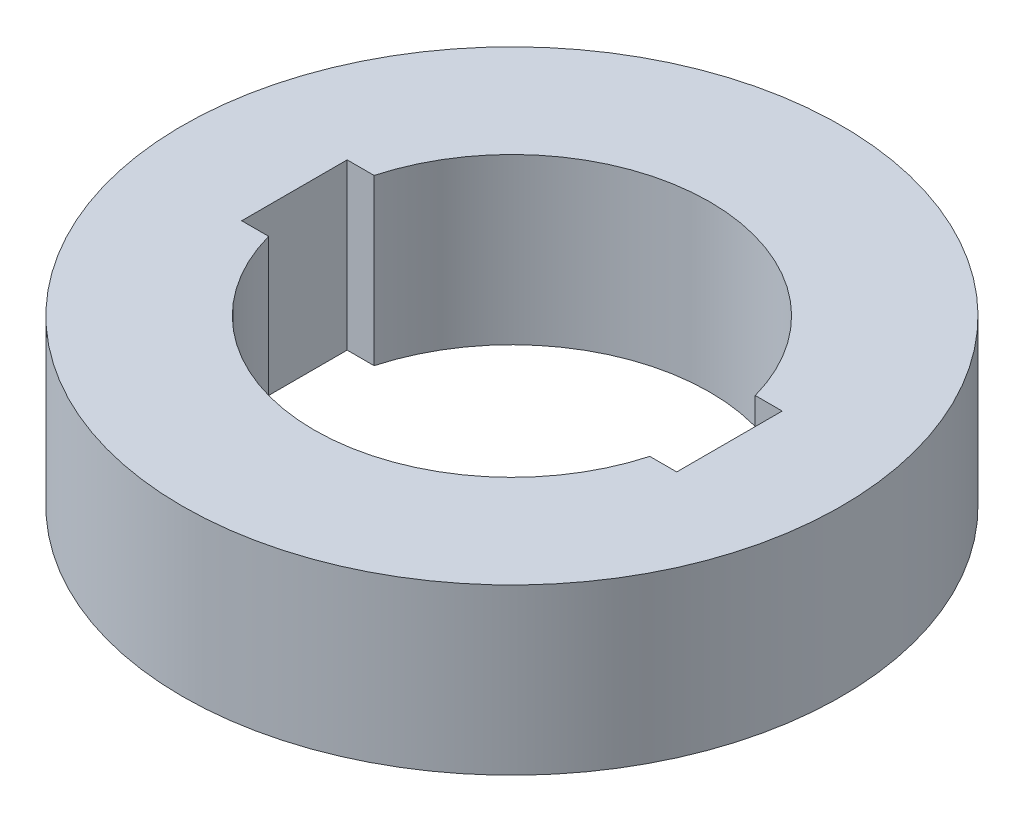
ISO-10303-21;
HEADER;
FILE_DESCRIPTION(('STEP AP214'),'2;1');
FILE_NAME('part.step','',(''),(''),'','','');
FILE_SCHEMA(('AUTOMOTIVE_DESIGN { 1 0 10303 214 1 1 1 1 }'));
ENDSEC;
DATA;
#1=APPLICATION_CONTEXT('core data for automotive mechanical design processes');
#2=APPLICATION_PROTOCOL_DEFINITION('international standard','automotive_design',2000,#1);
#3=PRODUCT_CONTEXT('',#1,'mechanical');
#4=PRODUCT('Part','Part','',(#3));
#5=PRODUCT_RELATED_PRODUCT_CATEGORY('part','',(#4));
#6=PRODUCT_DEFINITION_FORMATION('','',#4);
#7=PRODUCT_DEFINITION_CONTEXT('part definition',#1,'design');
#8=PRODUCT_DEFINITION('design','',#6,#7);
#9=PRODUCT_DEFINITION_SHAPE('','',#8);
#10=(LENGTH_UNIT() NAMED_UNIT(*) SI_UNIT(.MILLI.,.METRE.));
#11=(NAMED_UNIT(*) PLANE_ANGLE_UNIT() SI_UNIT($,.RADIAN.));
#12=(NAMED_UNIT(*) SI_UNIT($,.STERADIAN.) SOLID_ANGLE_UNIT());
#13=UNCERTAINTY_MEASURE_WITH_UNIT(LENGTH_MEASURE(1.E-05),#10,'distance_accuracy_value','');
#14=(GEOMETRIC_REPRESENTATION_CONTEXT(3) GLOBAL_UNCERTAINTY_ASSIGNED_CONTEXT((#13)) GLOBAL_UNIT_ASSIGNED_CONTEXT((#10,
#11,#12)) REPRESENTATION_CONTEXT('',''));
#15=CARTESIAN_POINT('',(0.,0.,0.));
#16=DIRECTION('',(0.,0.,1.));
#17=DIRECTION('',(1.,0.,0.));
#18=AXIS2_PLACEMENT_3D('',#15,#16,#17);
#19=CARTESIAN_POINT('',(0.,12.5,0.));
#20=DIRECTION('',(0.,1.,0.));
#21=DIRECTION('',(0.,0.,1.));
#22=AXIS2_PLACEMENT_3D('',#19,#20,#21);
#23=PLANE('',#22);
#24=CARTESIAN_POINT('',(0.,12.5,0.));
#25=DIRECTION('',(0.,1.,0.));
#26=DIRECTION('',(0.,0.,1.));
#27=AXIS2_PLACEMENT_3D('',#24,#25,#26);
#28=CIRCLE('',#27,50.);
#29=CARTESIAN_POINT('',(0.,12.5,50.));
#30=VERTEX_POINT('',#29);
#31=EDGE_CURVE('E11',#30,#30,#28,.T.);
#32=ORIENTED_EDGE('',*,*,#31,.T.);
#33=EDGE_LOOP('',(#32));
#34=FACE_BOUND('',#33,.T.);
#35=DIRECTION('',(-1.,0.,0.));
#36=VECTOR('',#35,1.);
#37=CARTESIAN_POINT('',(-28.9136645896019,12.5,-8.));
#38=LINE('',#37,#36);
#39=CARTESIAN_POINT('',(-28.9136645896019,12.5,-8.));
#40=VERTEX_POINT('',#39);
#41=CARTESIAN_POINT('',(-33.,12.5,-7.99999999999999));
#42=VERTEX_POINT('',#41);
#43=EDGE_CURVE('E112',#40,#42,#38,.T.);
#44=ORIENTED_EDGE('',*,*,#43,.F.);
#45=CARTESIAN_POINT('',(0.,12.5,0.));
#46=DIRECTION('',(0.,1.,0.));
#47=DIRECTION('',(0.,0.,1.));
#48=AXIS2_PLACEMENT_3D('',#45,#46,#47);
#49=CIRCLE('',#48,30.);
#50=CARTESIAN_POINT('',(28.9136645896019,12.5,-8.));
#51=VERTEX_POINT('',#50);
#52=EDGE_CURVE('E104',#51,#40,#49,.T.);
#53=ORIENTED_EDGE('',*,*,#52,.F.);
#54=DIRECTION('',(-1.,0.,0.));
#55=VECTOR('',#54,1.);
#56=CARTESIAN_POINT('',(28.9136645896019,12.5,-8.));
#57=LINE('',#56,#55);
#58=CARTESIAN_POINT('',(33.,12.5,-8.));
#59=VERTEX_POINT('',#58);
#60=EDGE_CURVE('E136',#59,#51,#57,.T.);
#61=ORIENTED_EDGE('',*,*,#60,.F.);
#62=DIRECTION('',(0.,0.,-1.));
#63=VECTOR('',#62,1.);
#64=CARTESIAN_POINT('',(33.,12.5,-8.));
#65=LINE('',#64,#63);
#66=CARTESIAN_POINT('',(33.,12.5,8.));
#67=VERTEX_POINT('',#66);
#68=EDGE_CURVE('E134',#67,#59,#65,.T.);
#69=ORIENTED_EDGE('',*,*,#68,.F.);
#70=DIRECTION('',(1.,0.,0.));
#71=VECTOR('',#70,1.);
#72=CARTESIAN_POINT('',(33.,12.5,8.));
#73=LINE('',#72,#71);
#74=CARTESIAN_POINT('',(28.9136645896019,12.5,8.));
#75=VERTEX_POINT('',#74);
#76=EDGE_CURVE('E132',#75,#67,#73,.T.);
#77=ORIENTED_EDGE('',*,*,#76,.F.);
#78=CARTESIAN_POINT('',(0.,12.5,0.));
#79=DIRECTION('',(0.,1.,0.));
#80=DIRECTION('',(0.,0.,1.));
#81=AXIS2_PLACEMENT_3D('',#78,#79,#80);
#82=CIRCLE('',#81,30.);
#83=CARTESIAN_POINT('',(-28.9136645896019,12.5,8.));
#84=VERTEX_POINT('',#83);
#85=EDGE_CURVE('E130',#84,#75,#82,.T.);
#86=ORIENTED_EDGE('',*,*,#85,.F.);
#87=DIRECTION('',(1.,0.,0.));
#88=VECTOR('',#87,1.);
#89=CARTESIAN_POINT('',(-33.,12.5,7.99999999999999));
#90=LINE('',#89,#88);
#91=CARTESIAN_POINT('',(-33.,12.5,7.99999999999999));
#92=VERTEX_POINT('',#91);
#93=EDGE_CURVE('E126',#92,#84,#90,.T.);
#94=ORIENTED_EDGE('',*,*,#93,.F.);
#95=DIRECTION('',(0.,0.,1.));
#96=VECTOR('',#95,1.);
#97=CARTESIAN_POINT('',(-33.,12.5,-7.99999999999999));
#98=LINE('',#97,#96);
#99=EDGE_CURVE('E124',#42,#92,#98,.T.);
#100=ORIENTED_EDGE('',*,*,#99,.F.);
#101=EDGE_LOOP('',(#44,#53,#61,#69,#77,#86,#94,#100));
#102=FACE_BOUND('',#101,.T.);
#103=ADVANCED_FACE('F39',(#34,#102),#23,.T.);
#104=CARTESIAN_POINT('',(0.,-12.5,0.));
#105=DIRECTION('',(0.,1.,0.));
#106=DIRECTION('',(0.,0.,1.));
#107=AXIS2_PLACEMENT_3D('',#104,#105,#106);
#108=PLANE('',#107);
#109=CARTESIAN_POINT('',(0.,-12.5,0.));
#110=DIRECTION('',(0.,1.,0.));
#111=DIRECTION('',(0.,0.,1.));
#112=AXIS2_PLACEMENT_3D('',#109,#110,#111);
#113=CIRCLE('',#112,50.);
#114=CARTESIAN_POINT('',(0.,-12.5,50.));
#115=VERTEX_POINT('',#114);
#116=EDGE_CURVE('E43',#115,#115,#113,.T.);
#117=ORIENTED_EDGE('',*,*,#116,.F.);
#118=EDGE_LOOP('',(#117));
#119=FACE_BOUND('',#118,.T.);
#120=CARTESIAN_POINT('',(0.,-12.5,0.));
#121=DIRECTION('',(0.,1.,0.));
#122=DIRECTION('',(0.,0.,1.));
#123=AXIS2_PLACEMENT_3D('',#120,#121,#122);
#124=CIRCLE('',#123,30.);
#125=CARTESIAN_POINT('',(28.9136645896019,-12.5,-8.));
#126=VERTEX_POINT('',#125);
#127=CARTESIAN_POINT('',(-28.9136645896019,-12.5,-8.));
#128=VERTEX_POINT('',#127);
#129=EDGE_CURVE('E62',#126,#128,#124,.T.);
#130=ORIENTED_EDGE('',*,*,#129,.T.);
#131=DIRECTION('',(-1.,0.,0.));
#132=VECTOR('',#131,1.);
#133=CARTESIAN_POINT('',(-28.9136645896019,-12.5,-8.));
#134=LINE('',#133,#132);
#135=CARTESIAN_POINT('',(-33.,-12.5,-7.99999999999999));
#136=VERTEX_POINT('',#135);
#137=EDGE_CURVE('E119',#128,#136,#134,.T.);
#138=ORIENTED_EDGE('',*,*,#137,.T.);
#139=DIRECTION('',(0.,0.,1.));
#140=VECTOR('',#139,1.);
#141=CARTESIAN_POINT('',(-33.,-12.5,-7.99999999999999));
#142=LINE('',#141,#140);
#143=CARTESIAN_POINT('',(-33.,-12.5,7.99999999999999));
#144=VERTEX_POINT('',#143);
#145=EDGE_CURVE('E140',#136,#144,#142,.T.);
#146=ORIENTED_EDGE('',*,*,#145,.T.);
#147=DIRECTION('',(1.,0.,0.));
#148=VECTOR('',#147,1.);
#149=CARTESIAN_POINT('',(-33.,-12.5,7.99999999999999));
#150=LINE('',#149,#148);
#151=CARTESIAN_POINT('',(-28.9136645896019,-12.5,8.));
#152=VERTEX_POINT('',#151);
#153=EDGE_CURVE('E143',#144,#152,#150,.T.);
#154=ORIENTED_EDGE('',*,*,#153,.T.);
#155=CARTESIAN_POINT('',(0.,-12.5,0.));
#156=DIRECTION('',(0.,1.,0.));
#157=DIRECTION('',(0.,0.,1.));
#158=AXIS2_PLACEMENT_3D('',#155,#156,#157);
#159=CIRCLE('',#158,30.);
#160=CARTESIAN_POINT('',(28.9136645896019,-12.5,8.));
#161=VERTEX_POINT('',#160);
#162=EDGE_CURVE('E146',#152,#161,#159,.T.);
#163=ORIENTED_EDGE('',*,*,#162,.T.);
#164=DIRECTION('',(1.,0.,0.));
#165=VECTOR('',#164,1.);
#166=CARTESIAN_POINT('',(33.,-12.5,8.));
#167=LINE('',#166,#165);
#168=CARTESIAN_POINT('',(33.,-12.5,8.));
#169=VERTEX_POINT('',#168);
#170=EDGE_CURVE('E149',#161,#169,#167,.T.);
#171=ORIENTED_EDGE('',*,*,#170,.T.);
#172=DIRECTION('',(0.,0.,-1.));
#173=VECTOR('',#172,1.);
#174=CARTESIAN_POINT('',(33.,-12.5,-8.));
#175=LINE('',#174,#173);
#176=CARTESIAN_POINT('',(33.,-12.5,-8.));
#177=VERTEX_POINT('',#176);
#178=EDGE_CURVE('E152',#169,#177,#175,.T.);
#179=ORIENTED_EDGE('',*,*,#178,.T.);
#180=DIRECTION('',(-1.,0.,0.));
#181=VECTOR('',#180,1.);
#182=CARTESIAN_POINT('',(28.9136645896019,-12.5,-8.));
#183=LINE('',#182,#181);
#184=EDGE_CURVE('E113',#177,#126,#183,.T.);
#185=ORIENTED_EDGE('',*,*,#184,.T.);
#186=EDGE_LOOP('',(#130,#138,#146,#154,#163,#171,#179,#185));
#187=FACE_BOUND('',#186,.T.);
#188=ADVANCED_FACE('F173',(#119,#187),#108,.F.);
#189=CARTESIAN_POINT('',(0.,12.5,0.));
#190=DIRECTION('',(0.,-1.,0.));
#191=DIRECTION('',(0.,0.,-1.));
#192=AXIS2_PLACEMENT_3D('',#189,#190,#191);
#193=CYLINDRICAL_SURFACE('',#192,50.);
#194=ORIENTED_EDGE('',*,*,#31,.F.);
#195=EDGE_LOOP('',(#194));
#196=FACE_BOUND('',#195,.T.);
#197=ORIENTED_EDGE('',*,*,#116,.T.);
#198=EDGE_LOOP('',(#197));
#199=FACE_BOUND('',#198,.T.);
#200=ADVANCED_FACE('F41',(#196,#199),#193,.T.);
#201=CARTESIAN_POINT('',(0.,12.5,0.));
#202=DIRECTION('',(0.,-1.,0.));
#203=DIRECTION('',(0.,0.,-1.));
#204=AXIS2_PLACEMENT_3D('',#201,#202,#203);
#205=CYLINDRICAL_SURFACE('',#204,30.);
#206=ORIENTED_EDGE('',*,*,#129,.F.);
#207=DIRECTION('',(0.,-1.,0.));
#208=VECTOR('',#207,1.);
#209=CARTESIAN_POINT('',(28.9136645896019,12.5,-8.));
#210=LINE('',#209,#208);
#211=EDGE_CURVE('E108',#51,#126,#210,.T.);
#212=ORIENTED_EDGE('',*,*,#211,.F.);
#213=ORIENTED_EDGE('',*,*,#52,.T.);
#214=DIRECTION('',(0.,-1.,0.));
#215=VECTOR('',#214,1.);
#216=CARTESIAN_POINT('',(-28.9136645896019,12.5,-8.));
#217=LINE('',#216,#215);
#218=EDGE_CURVE('E107',#40,#128,#217,.T.);
#219=ORIENTED_EDGE('',*,*,#218,.T.);
#220=EDGE_LOOP('',(#206,#212,#213,#219));
#221=FACE_BOUND('',#220,.T.);
#222=ADVANCED_FACE('F106',(#221),#205,.F.);
#223=CARTESIAN_POINT('',(-28.9136645896019,12.5,-8.));
#224=DIRECTION('',(0.,0.,1.));
#225=DIRECTION('',(1.,0.,0.));
#226=AXIS2_PLACEMENT_3D('',#223,#224,#225);
#227=PLANE('',#226);
#228=ORIENTED_EDGE('',*,*,#137,.F.);
#229=ORIENTED_EDGE('',*,*,#218,.F.);
#230=ORIENTED_EDGE('',*,*,#43,.T.);
#231=DIRECTION('',(0.,-1.,0.));
#232=VECTOR('',#231,1.);
#233=CARTESIAN_POINT('',(-33.,12.5,-7.99999999999999));
#234=LINE('',#233,#232);
#235=EDGE_CURVE('E120',#42,#136,#234,.T.);
#236=ORIENTED_EDGE('',*,*,#235,.T.);
#237=EDGE_LOOP('',(#228,#229,#230,#236));
#238=FACE_BOUND('',#237,.T.);
#239=ADVANCED_FACE('F116',(#238),#227,.T.);
#240=CARTESIAN_POINT('',(-33.,12.5,-7.99999999999999));
#241=DIRECTION('',(1.,0.,0.));
#242=DIRECTION('',(0.,0.,-1.));
#243=AXIS2_PLACEMENT_3D('',#240,#241,#242);
#244=PLANE('',#243);
#245=ORIENTED_EDGE('',*,*,#145,.F.);
#246=ORIENTED_EDGE('',*,*,#235,.F.);
#247=ORIENTED_EDGE('',*,*,#99,.T.);
#248=DIRECTION('',(0.,-1.,0.));
#249=VECTOR('',#248,1.);
#250=CARTESIAN_POINT('',(-33.,12.5,7.99999999999999));
#251=LINE('',#250,#249);
#252=EDGE_CURVE('E165',#92,#144,#251,.T.);
#253=ORIENTED_EDGE('',*,*,#252,.T.);
#254=EDGE_LOOP('',(#245,#246,#247,#253));
#255=FACE_BOUND('',#254,.T.);
#256=ADVANCED_FACE('F169',(#255),#244,.T.);
#257=CARTESIAN_POINT('',(-33.,12.5,7.99999999999999));
#258=DIRECTION('',(0.,0.,-1.));
#259=DIRECTION('',(-1.,0.,0.));
#260=AXIS2_PLACEMENT_3D('',#257,#258,#259);
#261=PLANE('',#260);
#262=ORIENTED_EDGE('',*,*,#153,.F.);
#263=ORIENTED_EDGE('',*,*,#252,.F.);
#264=ORIENTED_EDGE('',*,*,#93,.T.);
#265=DIRECTION('',(0.,-1.,0.));
#266=VECTOR('',#265,1.);
#267=CARTESIAN_POINT('',(-28.9136645896019,12.5,8.));
#268=LINE('',#267,#266);
#269=EDGE_CURVE('E163',#84,#152,#268,.T.);
#270=ORIENTED_EDGE('',*,*,#269,.T.);
#271=EDGE_LOOP('',(#262,#263,#264,#270));
#272=FACE_BOUND('',#271,.T.);
#273=ADVANCED_FACE('F191',(#272),#261,.T.);
#274=CARTESIAN_POINT('',(0.,12.5,0.));
#275=DIRECTION('',(0.,-1.,0.));
#276=DIRECTION('',(0.,0.,-1.));
#277=AXIS2_PLACEMENT_3D('',#274,#275,#276);
#278=CYLINDRICAL_SURFACE('',#277,30.);
#279=ORIENTED_EDGE('',*,*,#162,.F.);
#280=ORIENTED_EDGE('',*,*,#269,.F.);
#281=ORIENTED_EDGE('',*,*,#85,.T.);
#282=DIRECTION('',(0.,-1.,0.));
#283=VECTOR('',#282,1.);
#284=CARTESIAN_POINT('',(28.9136645896019,12.5,8.));
#285=LINE('',#284,#283);
#286=EDGE_CURVE('E161',#75,#161,#285,.T.);
#287=ORIENTED_EDGE('',*,*,#286,.T.);
#288=EDGE_LOOP('',(#279,#280,#281,#287));
#289=FACE_BOUND('',#288,.T.);
#290=ADVANCED_FACE('F188',(#289),#278,.F.);
#291=CARTESIAN_POINT('',(33.,12.5,8.));
#292=DIRECTION('',(0.,0.,-1.));
#293=DIRECTION('',(-1.,0.,0.));
#294=AXIS2_PLACEMENT_3D('',#291,#292,#293);
#295=PLANE('',#294);
#296=ORIENTED_EDGE('',*,*,#170,.F.);
#297=ORIENTED_EDGE('',*,*,#286,.F.);
#298=ORIENTED_EDGE('',*,*,#76,.T.);
#299=DIRECTION('',(0.,-1.,0.));
#300=VECTOR('',#299,1.);
#301=CARTESIAN_POINT('',(33.,12.5,8.));
#302=LINE('',#301,#300);
#303=EDGE_CURVE('E159',#67,#169,#302,.T.);
#304=ORIENTED_EDGE('',*,*,#303,.T.);
#305=EDGE_LOOP('',(#296,#297,#298,#304));
#306=FACE_BOUND('',#305,.T.);
#307=ADVANCED_FACE('F184',(#306),#295,.T.);
#308=CARTESIAN_POINT('',(33.,12.5,-8.));
#309=DIRECTION('',(-1.,0.,0.));
#310=DIRECTION('',(0.,0.,1.));
#311=AXIS2_PLACEMENT_3D('',#308,#309,#310);
#312=PLANE('',#311);
#313=ORIENTED_EDGE('',*,*,#178,.F.);
#314=ORIENTED_EDGE('',*,*,#303,.F.);
#315=ORIENTED_EDGE('',*,*,#68,.T.);
#316=DIRECTION('',(0.,-1.,0.));
#317=VECTOR('',#316,1.);
#318=CARTESIAN_POINT('',(33.,12.5,-8.));
#319=LINE('',#318,#317);
#320=EDGE_CURVE('E54',#59,#177,#319,.T.);
#321=ORIENTED_EDGE('',*,*,#320,.T.);
#322=EDGE_LOOP('',(#313,#314,#315,#321));
#323=FACE_BOUND('',#322,.T.);
#324=ADVANCED_FACE('F181',(#323),#312,.T.);
#325=CARTESIAN_POINT('',(28.9136645896019,12.5,-8.));
#326=DIRECTION('',(0.,0.,1.));
#327=DIRECTION('',(1.,0.,0.));
#328=AXIS2_PLACEMENT_3D('',#325,#326,#327);
#329=PLANE('',#328);
#330=ORIENTED_EDGE('',*,*,#184,.F.);
#331=ORIENTED_EDGE('',*,*,#320,.F.);
#332=ORIENTED_EDGE('',*,*,#60,.T.);
#333=ORIENTED_EDGE('',*,*,#211,.T.);
#334=EDGE_LOOP('',(#330,#331,#332,#333));
#335=FACE_BOUND('',#334,.T.);
#336=ADVANCED_FACE('F175',(#335),#329,.T.);
#337=CLOSED_SHELL('',(#103,#188,#200,#222,#239,#256,#273,#290,#307,#324,#336));
#338=MANIFOLD_SOLID_BREP('B2',#337);
#339=ADVANCED_BREP_SHAPE_REPRESENTATION('',(#18,#338),#14);
#340=SHAPE_DEFINITION_REPRESENTATION(#9,#339);
ENDSEC;
END-ISO-10303-21;
